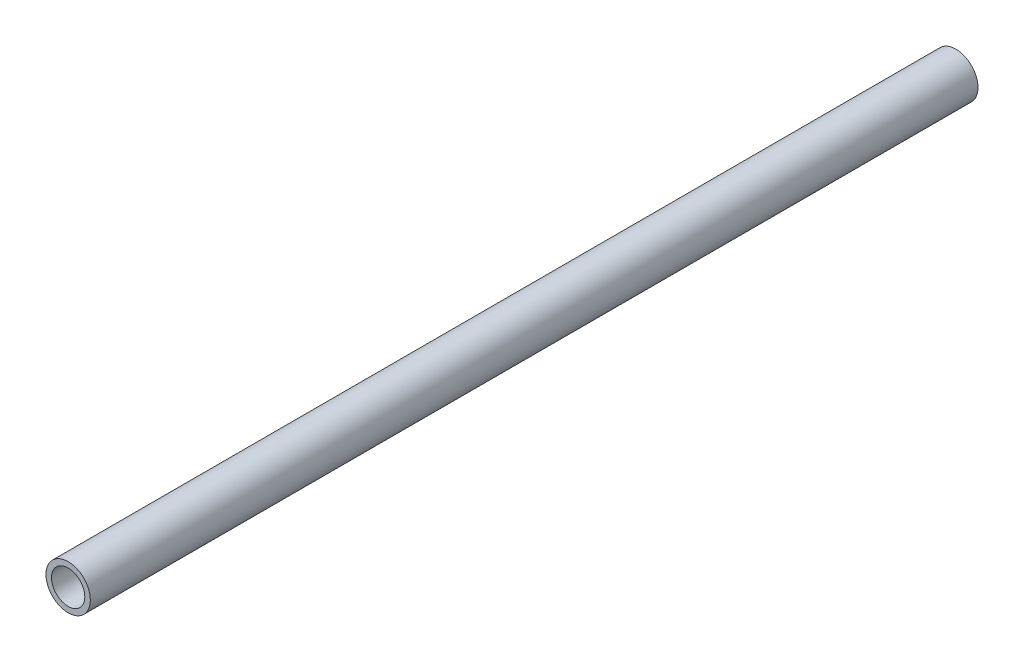
ISO-10303-21;
HEADER;
FILE_DESCRIPTION(('STEP AP214'),'2;1');
FILE_NAME('part.step','',(''),(''),'','','');
FILE_SCHEMA(('AUTOMOTIVE_DESIGN { 1 0 10303 214 1 1 1 1 }'));
ENDSEC;
DATA;
#1=APPLICATION_CONTEXT('core data for automotive mechanical design processes');
#2=APPLICATION_PROTOCOL_DEFINITION('international standard','automotive_design',2000,#1);
#3=PRODUCT_CONTEXT('',#1,'mechanical');
#4=PRODUCT('Part','Part','',(#3));
#5=PRODUCT_RELATED_PRODUCT_CATEGORY('part','',(#4));
#6=PRODUCT_DEFINITION_FORMATION('','',#4);
#7=PRODUCT_DEFINITION_CONTEXT('part definition',#1,'design');
#8=PRODUCT_DEFINITION('design','',#6,#7);
#9=PRODUCT_DEFINITION_SHAPE('','',#8);
#10=(LENGTH_UNIT() NAMED_UNIT(*) SI_UNIT(.MILLI.,.METRE.));
#11=(NAMED_UNIT(*) PLANE_ANGLE_UNIT() SI_UNIT($,.RADIAN.));
#12=(NAMED_UNIT(*) SI_UNIT($,.STERADIAN.) SOLID_ANGLE_UNIT());
#13=UNCERTAINTY_MEASURE_WITH_UNIT(LENGTH_MEASURE(1.E-05),#10,'distance_accuracy_value','');
#14=(GEOMETRIC_REPRESENTATION_CONTEXT(3) GLOBAL_UNCERTAINTY_ASSIGNED_CONTEXT((#13)) GLOBAL_UNIT_ASSIGNED_CONTEXT((#10,
#11,#12)) REPRESENTATION_CONTEXT('',''));
#15=CARTESIAN_POINT('',(0.,0.,0.));
#16=DIRECTION('',(0.,0.,1.));
#17=DIRECTION('',(1.,0.,0.));
#18=AXIS2_PLACEMENT_3D('',#15,#16,#17);
#19=CARTESIAN_POINT('',(0.,0.,40.));
#20=DIRECTION('',(0.,0.,-1.));
#21=DIRECTION('',(-1.,0.,0.));
#22=AXIS2_PLACEMENT_3D('',#19,#20,#21);
#23=CYLINDRICAL_SURFACE('',#22,1.);
#24=CARTESIAN_POINT('',(0.,0.,40.));
#25=DIRECTION('',(0.,0.,1.));
#26=DIRECTION('',(1.,0.,0.));
#27=AXIS2_PLACEMENT_3D('',#24,#25,#26);
#28=CIRCLE('',#27,1.);
#29=CARTESIAN_POINT('',(1.,0.,40.));
#30=VERTEX_POINT('',#29);
#31=EDGE_CURVE('E10',#30,#30,#28,.T.);
#32=ORIENTED_EDGE('',*,*,#31,.F.);
#33=EDGE_LOOP('',(#32));
#34=FACE_BOUND('',#33,.T.);
#35=CARTESIAN_POINT('',(0.,0.,0.));
#36=DIRECTION('',(0.,0.,1.));
#37=DIRECTION('',(1.,0.,0.));
#38=AXIS2_PLACEMENT_3D('',#35,#36,#37);
#39=CIRCLE('',#38,1.);
#40=CARTESIAN_POINT('',(1.,0.,0.));
#41=VERTEX_POINT('',#40);
#42=EDGE_CURVE('E44',#41,#41,#39,.T.);
#43=ORIENTED_EDGE('',*,*,#42,.T.);
#44=EDGE_LOOP('',(#43));
#45=FACE_BOUND('',#44,.T.);
#46=ADVANCED_FACE('F41',(#34,#45),#23,.T.);
#47=CARTESIAN_POINT('',(0.,0.,40.));
#48=DIRECTION('',(0.,0.,1.));
#49=DIRECTION('',(1.,0.,0.));
#50=AXIS2_PLACEMENT_3D('',#47,#48,#49);
#51=PLANE('',#50);
#52=CARTESIAN_POINT('',(0.,0.,40.));
#53=DIRECTION('',(0.,0.,1.));
#54=DIRECTION('',(1.,0.,0.));
#55=AXIS2_PLACEMENT_3D('',#52,#53,#54);
#56=CIRCLE('',#55,0.75);
#57=CARTESIAN_POINT('',(0.75,0.,40.));
#58=VERTEX_POINT('',#57);
#59=EDGE_CURVE('E55',#58,#58,#56,.T.);
#60=ORIENTED_EDGE('',*,*,#59,.F.);
#61=EDGE_LOOP('',(#60));
#62=FACE_BOUND('',#61,.T.);
#63=ORIENTED_EDGE('',*,*,#31,.T.);
#64=EDGE_LOOP('',(#63));
#65=FACE_BOUND('',#64,.T.);
#66=ADVANCED_FACE('F72',(#62,#65),#51,.T.);
#67=CARTESIAN_POINT('',(0.,0.,0.));
#68=DIRECTION('',(0.,0.,1.));
#69=DIRECTION('',(1.,0.,0.));
#70=AXIS2_PLACEMENT_3D('',#67,#68,#69);
#71=PLANE('',#70);
#72=CARTESIAN_POINT('',(0.,0.,0.));
#73=DIRECTION('',(0.,0.,1.));
#74=DIRECTION('',(1.,0.,0.));
#75=AXIS2_PLACEMENT_3D('',#72,#73,#74);
#76=CIRCLE('',#75,0.75);
#77=CARTESIAN_POINT('',(0.75,0.,0.));
#78=VERTEX_POINT('',#77);
#79=EDGE_CURVE('E53',#78,#78,#76,.T.);
#80=ORIENTED_EDGE('',*,*,#79,.T.);
#81=EDGE_LOOP('',(#80));
#82=FACE_BOUND('',#81,.T.);
#83=ORIENTED_EDGE('',*,*,#42,.F.);
#84=EDGE_LOOP('',(#83));
#85=FACE_BOUND('',#84,.T.);
#86=ADVANCED_FACE('F63',(#82,#85),#71,.F.);
#87=CARTESIAN_POINT('',(0.,0.,0.));
#88=DIRECTION('',(0.,0.,1.));
#89=DIRECTION('',(1.,0.,0.));
#90=AXIS2_PLACEMENT_3D('',#87,#88,#89);
#91=CYLINDRICAL_SURFACE('',#90,0.75);
#92=ORIENTED_EDGE('',*,*,#79,.F.);
#93=EDGE_LOOP('',(#92));
#94=FACE_BOUND('',#93,.T.);
#95=ORIENTED_EDGE('',*,*,#59,.T.);
#96=EDGE_LOOP('',(#95));
#97=FACE_BOUND('',#96,.T.);
#98=ADVANCED_FACE('F66',(#94,#97),#91,.F.);
#99=CLOSED_SHELL('',(#46,#66,#86,#98));
#100=MANIFOLD_SOLID_BREP('B2',#99);
#101=ADVANCED_BREP_SHAPE_REPRESENTATION('',(#18,#100),#14);
#102=SHAPE_DEFINITION_REPRESENTATION(#9,#101);
ENDSEC;
END-ISO-10303-21;
